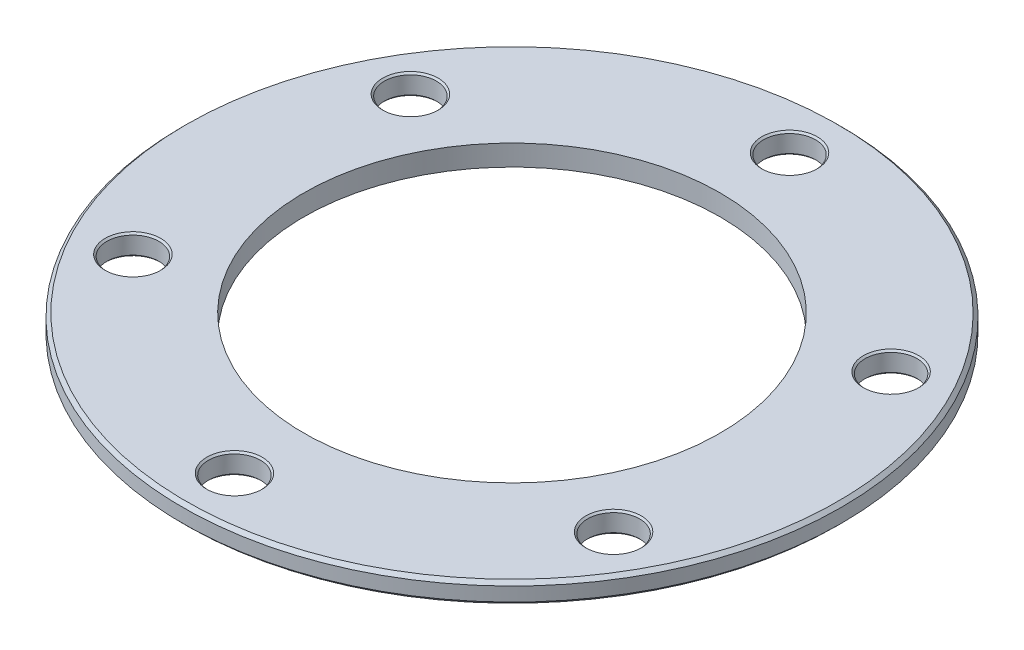
ISO-10303-21;
HEADER;
FILE_DESCRIPTION(('STEP AP214'),'2;1');
FILE_NAME('part.step','',(''),(''),'','','');
FILE_SCHEMA(('AUTOMOTIVE_DESIGN { 1 0 10303 214 1 1 1 1 }'));
ENDSEC;
DATA;
#1=APPLICATION_CONTEXT('core data for automotive mechanical design processes');
#2=APPLICATION_PROTOCOL_DEFINITION('international standard','automotive_design',2000,#1);
#3=PRODUCT_CONTEXT('',#1,'mechanical');
#4=PRODUCT('Part','Part','',(#3));
#5=PRODUCT_RELATED_PRODUCT_CATEGORY('part','',(#4));
#6=PRODUCT_DEFINITION_FORMATION('','',#4);
#7=PRODUCT_DEFINITION_CONTEXT('part definition',#1,'design');
#8=PRODUCT_DEFINITION('design','',#6,#7);
#9=PRODUCT_DEFINITION_SHAPE('','',#8);
#10=(LENGTH_UNIT() NAMED_UNIT(*) SI_UNIT(.MILLI.,.METRE.));
#11=(NAMED_UNIT(*) PLANE_ANGLE_UNIT() SI_UNIT($,.RADIAN.));
#12=(NAMED_UNIT(*) SI_UNIT($,.STERADIAN.) SOLID_ANGLE_UNIT());
#13=UNCERTAINTY_MEASURE_WITH_UNIT(LENGTH_MEASURE(1.E-05),#10,'distance_accuracy_value','');
#14=(GEOMETRIC_REPRESENTATION_CONTEXT(3) GLOBAL_UNCERTAINTY_ASSIGNED_CONTEXT((#13)) GLOBAL_UNIT_ASSIGNED_CONTEXT((#10,
#11,#12)) REPRESENTATION_CONTEXT('',''));
#15=CARTESIAN_POINT('',(0.,0.,0.));
#16=DIRECTION('',(0.,0.,1.));
#17=DIRECTION('',(1.,0.,0.));
#18=AXIS2_PLACEMENT_3D('',#15,#16,#17);
#19=CARTESIAN_POINT('',(0.,5.,0.));
#20=DIRECTION('',(0.,-1.,0.));
#21=DIRECTION('',(1.,0.,0.));
#22=AXIS2_PLACEMENT_3D('',#19,#20,#21);
#23=CYLINDRICAL_SURFACE('',#22,95.);
#24=CARTESIAN_POINT('',(0.,-1.14491749414469E-13,0.));
#25=DIRECTION('',(0.,-1.,0.));
#26=DIRECTION('',(1.,0.,0.));
#27=AXIS2_PLACEMENT_3D('',#24,#25,#26);
#28=CIRCLE('',#27,95.);
#29=CARTESIAN_POINT('',(95.,-1.02857604822569E-13,0.));
#30=VERTEX_POINT('',#29);
#31=EDGE_CURVE('E51',#30,#30,#28,.F.);
#32=ORIENTED_EDGE('',*,*,#31,.T.);
#33=EDGE_LOOP('',(#32));
#34=FACE_BOUND('',#33,.T.);
#35=CARTESIAN_POINT('',(0.,4.00000000000002,0.));
#36=DIRECTION('',(0.,1.,0.));
#37=DIRECTION('',(-1.,0.,0.));
#38=AXIS2_PLACEMENT_3D('',#35,#36,#37);
#39=CIRCLE('',#38,95.);
#40=CARTESIAN_POINT('',(-95.,4.00000000000001,0.));
#41=VERTEX_POINT('',#40);
#42=EDGE_CURVE('E55',#41,#41,#39,.F.);
#43=ORIENTED_EDGE('',*,*,#42,.T.);
#44=EDGE_LOOP('',(#43));
#45=FACE_BOUND('',#44,.T.);
#46=ADVANCED_FACE('F43',(#34,#45),#23,.T.);
#47=CARTESIAN_POINT('',(95.,5.00000000000001,0.));
#48=DIRECTION('',(0.,1.,0.));
#49=DIRECTION('',(-1.,0.,0.));
#50=AXIS2_PLACEMENT_3D('',#47,#48,#49);
#51=PLANE('',#50);
#52=CARTESIAN_POINT('',(0.,4.99999999999999,0.));
#53=DIRECTION('',(0.,1.,0.));
#54=DIRECTION('',(-1.,0.,0.));
#55=AXIS2_PLACEMENT_3D('',#52,#53,#54);
#56=CIRCLE('',#55,94.);
#57=CARTESIAN_POINT('',(-94.,4.99999999999998,0.));
#58=VERTEX_POINT('',#57);
#59=EDGE_CURVE('E10',#58,#58,#56,.T.);
#60=ORIENTED_EDGE('',*,*,#59,.T.);
#61=EDGE_LOOP('',(#60));
#62=FACE_BOUND('',#61,.T.);
#63=CARTESIAN_POINT('',(-69.2820323027551,4.99999999999999,-40.));
#64=DIRECTION('',(0.,1.,0.));
#65=DIRECTION('',(-1.,0.,0.));
#66=AXIS2_PLACEMENT_3D('',#63,#64,#65);
#67=CIRCLE('',#66,7.99999999999997);
#68=CARTESIAN_POINT('',(-77.2820323027551,4.99999999999999,-40.));
#69=VERTEX_POINT('',#68);
#70=EDGE_CURVE('E76',#69,#69,#67,.F.);
#71=ORIENTED_EDGE('',*,*,#70,.T.);
#72=EDGE_LOOP('',(#71));
#73=FACE_BOUND('',#72,.T.);
#74=CARTESIAN_POINT('',(69.2820323027551,5.,40.));
#75=DIRECTION('',(0.,1.,0.));
#76=DIRECTION('',(-1.,0.,0.));
#77=AXIS2_PLACEMENT_3D('',#74,#75,#76);
#78=CIRCLE('',#77,7.99999999999997);
#79=CARTESIAN_POINT('',(61.2820323027551,5.,40.));
#80=VERTEX_POINT('',#79);
#81=EDGE_CURVE('E79',#80,#80,#78,.F.);
#82=ORIENTED_EDGE('',*,*,#81,.T.);
#83=EDGE_LOOP('',(#82));
#84=FACE_BOUND('',#83,.T.);
#85=CARTESIAN_POINT('',(0.,4.99999999999999,80.));
#86=DIRECTION('',(0.,1.,0.));
#87=DIRECTION('',(-1.,0.,0.));
#88=AXIS2_PLACEMENT_3D('',#85,#86,#87);
#89=CIRCLE('',#88,7.99999999999995);
#90=CARTESIAN_POINT('',(-7.99999999999995,4.99999999999999,80.));
#91=VERTEX_POINT('',#90);
#92=EDGE_CURVE('E82',#91,#91,#89,.F.);
#93=ORIENTED_EDGE('',*,*,#92,.T.);
#94=EDGE_LOOP('',(#93));
#95=FACE_BOUND('',#94,.T.);
#96=CARTESIAN_POINT('',(0.,4.99999999999999,-80.));
#97=DIRECTION('',(0.,1.,0.));
#98=DIRECTION('',(-1.,0.,0.));
#99=AXIS2_PLACEMENT_3D('',#96,#97,#98);
#100=CIRCLE('',#99,7.99999999999995);
#101=CARTESIAN_POINT('',(-7.99999999999996,4.99999999999999,-80.));
#102=VERTEX_POINT('',#101);
#103=EDGE_CURVE('E85',#102,#102,#100,.F.);
#104=ORIENTED_EDGE('',*,*,#103,.T.);
#105=EDGE_LOOP('',(#104));
#106=FACE_BOUND('',#105,.T.);
#107=CARTESIAN_POINT('',(-69.2820323027551,4.99999999999999,40.));
#108=DIRECTION('',(0.,1.,0.));
#109=DIRECTION('',(-1.,0.,0.));
#110=AXIS2_PLACEMENT_3D('',#107,#108,#109);
#111=CIRCLE('',#110,7.99999999999989);
#112=CARTESIAN_POINT('',(-77.282032302755,4.99999999999999,40.));
#113=VERTEX_POINT('',#112);
#114=EDGE_CURVE('E88',#113,#113,#111,.F.);
#115=ORIENTED_EDGE('',*,*,#114,.T.);
#116=EDGE_LOOP('',(#115));
#117=FACE_BOUND('',#116,.T.);
#118=CARTESIAN_POINT('',(69.2820323027551,5.,-40.));
#119=DIRECTION('',(0.,1.,0.));
#120=DIRECTION('',(-1.,0.,0.));
#121=AXIS2_PLACEMENT_3D('',#118,#119,#120);
#122=CIRCLE('',#121,7.99999999999997);
#123=CARTESIAN_POINT('',(61.2820323027551,5.,-40.));
#124=VERTEX_POINT('',#123);
#125=EDGE_CURVE('E91',#124,#124,#122,.F.);
#126=ORIENTED_EDGE('',*,*,#125,.T.);
#127=EDGE_LOOP('',(#126));
#128=FACE_BOUND('',#127,.T.);
#129=CARTESIAN_POINT('',(0.,5.,0.));
#130=DIRECTION('',(0.,-1.,0.));
#131=DIRECTION('',(0.,0.,-1.));
#132=AXIS2_PLACEMENT_3D('',#129,#130,#131);
#133=CIRCLE('',#132,60.);
#134=CARTESIAN_POINT('',(0.,5.,-60.));
#135=VERTEX_POINT('',#134);
#136=EDGE_CURVE('E136',#135,#135,#133,.T.);
#137=ORIENTED_EDGE('',*,*,#136,.T.);
#138=EDGE_LOOP('',(#137));
#139=FACE_BOUND('',#138,.T.);
#140=ADVANCED_FACE('F147',(#62,#73,#84,#95,#106,#117,#128,#139),#51,.T.);
#141=CARTESIAN_POINT('',(0.,-1.00000000000001,0.));
#142=DIRECTION('',(0.,-1.,0.));
#143=DIRECTION('',(1.,0.,0.));
#144=AXIS2_PLACEMENT_3D('',#141,#142,#143);
#145=PLANE('',#144);
#146=CARTESIAN_POINT('',(0.,-1.00000000000001,0.));
#147=DIRECTION('',(0.,-1.,0.));
#148=DIRECTION('',(1.,0.,0.));
#149=AXIS2_PLACEMENT_3D('',#146,#147,#148);
#150=CIRCLE('',#149,94.0000000000001);
#151=CARTESIAN_POINT('',(94.0000000000001,-0.999999999999994,0.));
#152=VERTEX_POINT('',#151);
#153=EDGE_CURVE('E59',#152,#152,#150,.T.);
#154=ORIENTED_EDGE('',*,*,#153,.T.);
#155=EDGE_LOOP('',(#154));
#156=FACE_BOUND('',#155,.T.);
#157=CARTESIAN_POINT('',(69.2820323027551,-0.999999999999997,-40.));
#158=DIRECTION('',(0.,-1.,0.));
#159=DIRECTION('',(1.,0.,0.));
#160=AXIS2_PLACEMENT_3D('',#157,#158,#159);
#161=CIRCLE('',#160,7.99999999999997);
#162=CARTESIAN_POINT('',(77.2820323027551,-0.999999999999996,-40.));
#163=VERTEX_POINT('',#162);
#164=EDGE_CURVE('E118',#163,#163,#161,.F.);
#165=ORIENTED_EDGE('',*,*,#164,.T.);
#166=EDGE_LOOP('',(#165));
#167=FACE_BOUND('',#166,.T.);
#168=CARTESIAN_POINT('',(0.,-1.00000000000001,80.));
#169=DIRECTION('',(0.,-1.,0.));
#170=DIRECTION('',(1.,0.,0.));
#171=AXIS2_PLACEMENT_3D('',#168,#169,#170);
#172=CIRCLE('',#171,7.99999999999991);
#173=CARTESIAN_POINT('',(7.99999999999991,-1.,80.));
#174=VERTEX_POINT('',#173);
#175=EDGE_CURVE('E121',#174,#174,#172,.F.);
#176=ORIENTED_EDGE('',*,*,#175,.T.);
#177=EDGE_LOOP('',(#176));
#178=FACE_BOUND('',#177,.T.);
#179=CARTESIAN_POINT('',(69.2820323027551,-0.999999999999997,40.));
#180=DIRECTION('',(0.,-1.,0.));
#181=DIRECTION('',(1.,0.,0.));
#182=AXIS2_PLACEMENT_3D('',#179,#180,#181);
#183=CIRCLE('',#182,7.99999999999997);
#184=CARTESIAN_POINT('',(77.2820323027551,-0.999999999999996,40.));
#185=VERTEX_POINT('',#184);
#186=EDGE_CURVE('E124',#185,#185,#183,.F.);
#187=ORIENTED_EDGE('',*,*,#186,.T.);
#188=EDGE_LOOP('',(#187));
#189=FACE_BOUND('',#188,.T.);
#190=CARTESIAN_POINT('',(-69.2820323027551,-1.00000000000001,40.));
#191=DIRECTION('',(0.,-1.,0.));
#192=DIRECTION('',(1.,0.,0.));
#193=AXIS2_PLACEMENT_3D('',#190,#191,#192);
#194=CIRCLE('',#193,8.00000000000001);
#195=CARTESIAN_POINT('',(-61.2820323027551,-1.00000000000001,40.));
#196=VERTEX_POINT('',#195);
#197=EDGE_CURVE('E127',#196,#196,#194,.F.);
#198=ORIENTED_EDGE('',*,*,#197,.T.);
#199=EDGE_LOOP('',(#198));
#200=FACE_BOUND('',#199,.T.);
#201=CARTESIAN_POINT('',(-69.2820323027551,-1.00000000000001,-40.));
#202=DIRECTION('',(0.,-1.,0.));
#203=DIRECTION('',(1.,0.,0.));
#204=AXIS2_PLACEMENT_3D('',#201,#202,#203);
#205=CIRCLE('',#204,7.99999999999997);
#206=CARTESIAN_POINT('',(-61.2820323027551,-1.00000000000001,-40.));
#207=VERTEX_POINT('',#206);
#208=EDGE_CURVE('E130',#207,#207,#205,.F.);
#209=ORIENTED_EDGE('',*,*,#208,.T.);
#210=EDGE_LOOP('',(#209));
#211=FACE_BOUND('',#210,.T.);
#212=CARTESIAN_POINT('',(0.,-1.00000000000001,-80.));
#213=DIRECTION('',(0.,-1.,0.));
#214=DIRECTION('',(1.,0.,0.));
#215=AXIS2_PLACEMENT_3D('',#212,#213,#214);
#216=CIRCLE('',#215,7.99999999999999);
#217=CARTESIAN_POINT('',(7.99999999999998,-1.,-80.));
#218=VERTEX_POINT('',#217);
#219=EDGE_CURVE('E133',#218,#218,#216,.F.);
#220=ORIENTED_EDGE('',*,*,#219,.T.);
#221=EDGE_LOOP('',(#220));
#222=FACE_BOUND('',#221,.T.);
#223=CARTESIAN_POINT('',(0.,-1.,0.));
#224=DIRECTION('',(0.,-1.,0.));
#225=DIRECTION('',(0.,0.,-1.));
#226=AXIS2_PLACEMENT_3D('',#223,#224,#225);
#227=CIRCLE('',#226,60.);
#228=CARTESIAN_POINT('',(0.,-1.,-60.));
#229=VERTEX_POINT('',#228);
#230=EDGE_CURVE('E139',#229,#229,#227,.T.);
#231=ORIENTED_EDGE('',*,*,#230,.F.);
#232=EDGE_LOOP('',(#231));
#233=FACE_BOUND('',#232,.T.);
#234=ADVANCED_FACE('F145',(#156,#167,#178,#189,#200,#211,#222,#233),#145,.T.);
#235=CARTESIAN_POINT('',(0.,-1.00000000000001,0.));
#236=DIRECTION('',(0.,-1.,0.));
#237=DIRECTION('',(0.,0.,-1.));
#238=AXIS2_PLACEMENT_3D('',#235,#236,#237);
#239=CYLINDRICAL_SURFACE('',#238,60.);
#240=ORIENTED_EDGE('',*,*,#136,.F.);
#241=EDGE_LOOP('',(#240));
#242=FACE_BOUND('',#241,.T.);
#243=ORIENTED_EDGE('',*,*,#230,.T.);
#244=EDGE_LOOP('',(#243));
#245=FACE_BOUND('',#244,.T.);
#246=ADVANCED_FACE('F143',(#242,#245),#239,.F.);
#247=CARTESIAN_POINT('',(0.,-1.00000000000001,-80.));
#248=DIRECTION('',(0.,-1.,0.));
#249=DIRECTION('',(0.,0.,-1.));
#250=AXIS2_PLACEMENT_3D('',#247,#248,#249);
#251=CYLINDRICAL_SURFACE('',#250,7.49999999999999);
#252=CARTESIAN_POINT('',(0.,4.50000000000004,-80.));
#253=DIRECTION('',(0.,1.,0.));
#254=DIRECTION('',(0.,0.,1.));
#255=AXIS2_PLACEMENT_3D('',#252,#253,#254);
#256=CIRCLE('',#255,7.49999999999999);
#257=CARTESIAN_POINT('',(0.,4.50000000000004,-72.5));
#258=VERTEX_POINT('',#257);
#259=EDGE_CURVE('E64',#258,#258,#256,.T.);
#260=ORIENTED_EDGE('',*,*,#259,.T.);
#261=EDGE_LOOP('',(#260));
#262=FACE_BOUND('',#261,.T.);
#263=CARTESIAN_POINT('',(0.,-0.500000000000008,-80.));
#264=DIRECTION('',(0.,-1.,0.));
#265=DIRECTION('',(0.,0.,-1.));
#266=AXIS2_PLACEMENT_3D('',#263,#264,#265);
#267=CIRCLE('',#266,7.49999999999999);
#268=CARTESIAN_POINT('',(0.,-0.500000000000008,-87.5));
#269=VERTEX_POINT('',#268);
#270=EDGE_CURVE('E67',#269,#269,#267,.T.);
#271=ORIENTED_EDGE('',*,*,#270,.T.);
#272=EDGE_LOOP('',(#271));
#273=FACE_BOUND('',#272,.T.);
#274=ADVANCED_FACE('F155',(#262,#273),#251,.F.);
#275=CARTESIAN_POINT('',(-69.2820323027551,-1.00000000000001,-40.));
#276=DIRECTION('',(0.,-1.,0.));
#277=DIRECTION('',(0.,0.,-1.));
#278=AXIS2_PLACEMENT_3D('',#275,#276,#277);
#279=CYLINDRICAL_SURFACE('',#278,7.49999999999999);
#280=CARTESIAN_POINT('',(-69.2820323027551,4.49999999999999,-40.));
#281=DIRECTION('',(0.,1.,0.));
#282=DIRECTION('',(0.,0.,1.));
#283=AXIS2_PLACEMENT_3D('',#280,#281,#282);
#284=CIRCLE('',#283,7.49999999999999);
#285=CARTESIAN_POINT('',(-69.2820323027551,4.49999999999999,-32.5));
#286=VERTEX_POINT('',#285);
#287=EDGE_CURVE('E70',#286,#286,#284,.T.);
#288=ORIENTED_EDGE('',*,*,#287,.T.);
#289=EDGE_LOOP('',(#288));
#290=FACE_BOUND('',#289,.T.);
#291=CARTESIAN_POINT('',(-69.2820323027551,-0.500000000000019,-40.));
#292=DIRECTION('',(0.,-1.,0.));
#293=DIRECTION('',(0.,0.,-1.));
#294=AXIS2_PLACEMENT_3D('',#291,#292,#293);
#295=CIRCLE('',#294,7.49999999999999);
#296=CARTESIAN_POINT('',(-69.2820323027551,-0.500000000000019,-47.5));
#297=VERTEX_POINT('',#296);
#298=EDGE_CURVE('E73',#297,#297,#295,.T.);
#299=ORIENTED_EDGE('',*,*,#298,.T.);
#300=EDGE_LOOP('',(#299));
#301=FACE_BOUND('',#300,.T.);
#302=ADVANCED_FACE('F381',(#290,#301),#279,.F.);
#303=CARTESIAN_POINT('',(0.,4.99999999999999,80.));
#304=DIRECTION('',(0.,1.,0.));
#305=DIRECTION('',(0.,0.,1.));
#306=AXIS2_PLACEMENT_3D('',#303,#304,#305);
#307=CYLINDRICAL_SURFACE('',#306,7.49999999999999);
#308=CARTESIAN_POINT('',(0.,-0.500000000000079,80.));
#309=DIRECTION('',(0.,-1.,0.));
#310=DIRECTION('',(0.,0.,-1.));
#311=AXIS2_PLACEMENT_3D('',#308,#309,#310);
#312=CIRCLE('',#311,7.49999999999999);
#313=CARTESIAN_POINT('',(0.,-0.500000000000079,72.5));
#314=VERTEX_POINT('',#313);
#315=EDGE_CURVE('E106',#314,#314,#312,.T.);
#316=ORIENTED_EDGE('',*,*,#315,.T.);
#317=EDGE_LOOP('',(#316));
#318=FACE_BOUND('',#317,.T.);
#319=CARTESIAN_POINT('',(0.,4.50000000000003,80.));
#320=DIRECTION('',(0.,1.,0.));
#321=DIRECTION('',(0.,0.,1.));
#322=AXIS2_PLACEMENT_3D('',#319,#320,#321);
#323=CIRCLE('',#322,7.49999999999999);
#324=CARTESIAN_POINT('',(0.,4.50000000000003,87.5));
#325=VERTEX_POINT('',#324);
#326=EDGE_CURVE('E109',#325,#325,#323,.T.);
#327=ORIENTED_EDGE('',*,*,#326,.T.);
#328=EDGE_LOOP('',(#327));
#329=FACE_BOUND('',#328,.T.);
#330=ADVANCED_FACE('F371',(#318,#329),#307,.F.);
#331=CARTESIAN_POINT('',(69.2820323027551,4.99999999999999,40.));
#332=DIRECTION('',(0.,1.,0.));
#333=DIRECTION('',(0.,0.,1.));
#334=AXIS2_PLACEMENT_3D('',#331,#332,#333);
#335=CYLINDRICAL_SURFACE('',#334,7.49999999999999);
#336=CARTESIAN_POINT('',(69.2820323027551,-0.499999999999996,40.));
#337=DIRECTION('',(0.,-1.,0.));
#338=DIRECTION('',(0.,0.,-1.));
#339=AXIS2_PLACEMENT_3D('',#336,#337,#338);
#340=CIRCLE('',#339,7.49999999999999);
#341=CARTESIAN_POINT('',(69.2820323027551,-0.499999999999996,32.5));
#342=VERTEX_POINT('',#341);
#343=EDGE_CURVE('E100',#342,#342,#340,.T.);
#344=ORIENTED_EDGE('',*,*,#343,.T.);
#345=EDGE_LOOP('',(#344));
#346=FACE_BOUND('',#345,.T.);
#347=CARTESIAN_POINT('',(69.2820323027551,4.50000000000001,40.));
#348=DIRECTION('',(0.,1.,0.));
#349=DIRECTION('',(0.,0.,1.));
#350=AXIS2_PLACEMENT_3D('',#347,#348,#349);
#351=CIRCLE('',#350,7.49999999999999);
#352=CARTESIAN_POINT('',(69.2820323027551,4.50000000000001,47.5));
#353=VERTEX_POINT('',#352);
#354=EDGE_CURVE('E103',#353,#353,#351,.T.);
#355=ORIENTED_EDGE('',*,*,#354,.T.);
#356=EDGE_LOOP('',(#355));
#357=FACE_BOUND('',#356,.T.);
#358=ADVANCED_FACE('F361',(#346,#357),#335,.F.);
#359=CARTESIAN_POINT('',(69.2820323027551,4.99999999999999,-40.));
#360=DIRECTION('',(0.,1.,0.));
#361=DIRECTION('',(0.,0.,1.));
#362=AXIS2_PLACEMENT_3D('',#359,#360,#361);
#363=CYLINDRICAL_SURFACE('',#362,7.49999999999999);
#364=CARTESIAN_POINT('',(69.2820323027551,-0.499999999999996,-40.));
#365=DIRECTION('',(0.,-1.,0.));
#366=DIRECTION('',(0.,0.,-1.));
#367=AXIS2_PLACEMENT_3D('',#364,#365,#366);
#368=CIRCLE('',#367,7.49999999999999);
#369=CARTESIAN_POINT('',(69.2820323027551,-0.499999999999996,-47.5));
#370=VERTEX_POINT('',#369);
#371=EDGE_CURVE('E112',#370,#370,#368,.T.);
#372=ORIENTED_EDGE('',*,*,#371,.T.);
#373=EDGE_LOOP('',(#372));
#374=FACE_BOUND('',#373,.T.);
#375=CARTESIAN_POINT('',(69.2820323027551,4.50000000000001,-40.));
#376=DIRECTION('',(0.,1.,0.));
#377=DIRECTION('',(0.,0.,1.));
#378=AXIS2_PLACEMENT_3D('',#375,#376,#377);
#379=CIRCLE('',#378,7.49999999999999);
#380=CARTESIAN_POINT('',(69.2820323027551,4.50000000000001,-32.5));
#381=VERTEX_POINT('',#380);
#382=EDGE_CURVE('E115',#381,#381,#379,.T.);
#383=ORIENTED_EDGE('',*,*,#382,.T.);
#384=EDGE_LOOP('',(#383));
#385=FACE_BOUND('',#384,.T.);
#386=ADVANCED_FACE('F351',(#374,#385),#363,.F.);
#387=CARTESIAN_POINT('',(-69.2820323027551,4.99999999999999,40.));
#388=DIRECTION('',(0.,1.,0.));
#389=DIRECTION('',(0.,0.,1.));
#390=AXIS2_PLACEMENT_3D('',#387,#388,#389);
#391=CYLINDRICAL_SURFACE('',#390,7.49999999999999);
#392=CARTESIAN_POINT('',(-69.2820323027551,-0.499999999999987,40.));
#393=DIRECTION('',(0.,-1.,0.));
#394=DIRECTION('',(0.,0.,-1.));
#395=AXIS2_PLACEMENT_3D('',#392,#393,#394);
#396=CIRCLE('',#395,7.49999999999999);
#397=CARTESIAN_POINT('',(-69.2820323027551,-0.499999999999987,32.5));
#398=VERTEX_POINT('',#397);
#399=EDGE_CURVE('E94',#398,#398,#396,.T.);
#400=ORIENTED_EDGE('',*,*,#399,.T.);
#401=EDGE_LOOP('',(#400));
#402=FACE_BOUND('',#401,.T.);
#403=CARTESIAN_POINT('',(-69.2820323027551,4.50000000000007,40.));
#404=DIRECTION('',(0.,1.,0.));
#405=DIRECTION('',(0.,0.,1.));
#406=AXIS2_PLACEMENT_3D('',#403,#404,#405);
#407=CIRCLE('',#406,7.49999999999999);
#408=CARTESIAN_POINT('',(-69.2820323027551,4.50000000000007,47.5));
#409=VERTEX_POINT('',#408);
#410=EDGE_CURVE('E97',#409,#409,#407,.T.);
#411=ORIENTED_EDGE('',*,*,#410,.T.);
#412=EDGE_LOOP('',(#411));
#413=FACE_BOUND('',#412,.T.);
#414=ADVANCED_FACE('F175',(#402,#413),#391,.F.);
#415=CARTESIAN_POINT('',(69.2820323027551,-0.999999999999997,-40.));
#416=DIRECTION('',(0.,-1.,0.));
#417=DIRECTION('',(0.,0.,-1.));
#418=AXIS2_PLACEMENT_3D('',#415,#416,#417);
#419=CONICAL_SURFACE('',#418,7.99999999999997,0.785398163397427);
#420=ORIENTED_EDGE('',*,*,#371,.F.);
#421=EDGE_LOOP('',(#420));
#422=FACE_BOUND('',#421,.T.);
#423=ORIENTED_EDGE('',*,*,#164,.F.);
#424=EDGE_LOOP('',(#423));
#425=FACE_BOUND('',#424,.T.);
#426=ADVANCED_FACE('F168',(#422,#425),#419,.F.);
#427=CARTESIAN_POINT('',(0.,-1.00000000000001,80.));
#428=DIRECTION('',(0.,-1.,0.));
#429=DIRECTION('',(0.,0.,-1.));
#430=AXIS2_PLACEMENT_3D('',#427,#428,#429);
#431=CONICAL_SURFACE('',#430,7.99999999999991,0.785398163397439);
#432=ORIENTED_EDGE('',*,*,#315,.F.);
#433=EDGE_LOOP('',(#432));
#434=FACE_BOUND('',#433,.T.);
#435=ORIENTED_EDGE('',*,*,#175,.F.);
#436=EDGE_LOOP('',(#435));
#437=FACE_BOUND('',#436,.T.);
#438=ADVANCED_FACE('F174',(#434,#437),#431,.F.);
#439=CARTESIAN_POINT('',(69.2820323027551,-0.999999999999997,40.));
#440=DIRECTION('',(0.,-1.,0.));
#441=DIRECTION('',(0.,0.,-1.));
#442=AXIS2_PLACEMENT_3D('',#439,#440,#441);
#443=CONICAL_SURFACE('',#442,7.99999999999997,0.785398163397427);
#444=ORIENTED_EDGE('',*,*,#343,.F.);
#445=EDGE_LOOP('',(#444));
#446=FACE_BOUND('',#445,.T.);
#447=ORIENTED_EDGE('',*,*,#186,.F.);
#448=EDGE_LOOP('',(#447));
#449=FACE_BOUND('',#448,.T.);
#450=ADVANCED_FACE('F182',(#446,#449),#443,.F.);
#451=CARTESIAN_POINT('',(-69.2820323027551,-1.00000000000001,40.));
#452=DIRECTION('',(0.,-1.,0.));
#453=DIRECTION('',(0.,0.,-1.));
#454=AXIS2_PLACEMENT_3D('',#451,#452,#453);
#455=CONICAL_SURFACE('',#454,8.00000000000001,0.785398163397442);
#456=ORIENTED_EDGE('',*,*,#399,.F.);
#457=EDGE_LOOP('',(#456));
#458=FACE_BOUND('',#457,.T.);
#459=ORIENTED_EDGE('',*,*,#197,.F.);
#460=EDGE_LOOP('',(#459));
#461=FACE_BOUND('',#460,.T.);
#462=ADVANCED_FACE('F189',(#458,#461),#455,.F.);
#463=CARTESIAN_POINT('',(-69.2820323027551,4.99999999999999,-40.));
#464=DIRECTION('',(0.,1.,0.));
#465=DIRECTION('',(0.,0.,1.));
#466=AXIS2_PLACEMENT_3D('',#463,#464,#465);
#467=CONICAL_SURFACE('',#466,7.99999999999997,0.785398163397428);
#468=ORIENTED_EDGE('',*,*,#287,.F.);
#469=EDGE_LOOP('',(#468));
#470=FACE_BOUND('',#469,.T.);
#471=ORIENTED_EDGE('',*,*,#70,.F.);
#472=EDGE_LOOP('',(#471));
#473=FACE_BOUND('',#472,.T.);
#474=ADVANCED_FACE('F196',(#470,#473),#467,.F.);
#475=CARTESIAN_POINT('',(69.2820323027551,4.50000000000001,40.));
#476=DIRECTION('',(0.,1.,0.));
#477=DIRECTION('',(0.,0.,1.));
#478=AXIS2_PLACEMENT_3D('',#475,#476,#477);
#479=CONICAL_SURFACE('',#478,7.49999999999999,0.785398163397433);
#480=ORIENTED_EDGE('',*,*,#81,.F.);
#481=EDGE_LOOP('',(#480));
#482=FACE_BOUND('',#481,.T.);
#483=ORIENTED_EDGE('',*,*,#354,.F.);
#484=EDGE_LOOP('',(#483));
#485=FACE_BOUND('',#484,.T.);
#486=ADVANCED_FACE('F203',(#482,#485),#479,.F.);
#487=CARTESIAN_POINT('',(-69.2820323027551,-0.500000000000019,-40.));
#488=DIRECTION('',(0.,-1.,0.));
#489=DIRECTION('',(0.,0.,-1.));
#490=AXIS2_PLACEMENT_3D('',#487,#488,#489);
#491=CONICAL_SURFACE('',#490,7.49999999999999,0.785398163397433);
#492=ORIENTED_EDGE('',*,*,#208,.F.);
#493=EDGE_LOOP('',(#492));
#494=FACE_BOUND('',#493,.T.);
#495=ORIENTED_EDGE('',*,*,#298,.F.);
#496=EDGE_LOOP('',(#495));
#497=FACE_BOUND('',#496,.T.);
#498=ADVANCED_FACE('F210',(#494,#497),#491,.F.);
#499=CARTESIAN_POINT('',(0.,4.50000000000003,80.));
#500=DIRECTION('',(0.,1.,0.));
#501=DIRECTION('',(0.,0.,1.));
#502=AXIS2_PLACEMENT_3D('',#499,#500,#501);
#503=CONICAL_SURFACE('',#502,7.49999999999999,0.785398163397438);
#504=ORIENTED_EDGE('',*,*,#92,.F.);
#505=EDGE_LOOP('',(#504));
#506=FACE_BOUND('',#505,.T.);
#507=ORIENTED_EDGE('',*,*,#326,.F.);
#508=EDGE_LOOP('',(#507));
#509=FACE_BOUND('',#508,.T.);
#510=ADVANCED_FACE('F217',(#506,#509),#503,.F.);
#511=CARTESIAN_POINT('',(0.,4.99999999999999,-80.));
#512=DIRECTION('',(0.,1.,0.));
#513=DIRECTION('',(0.,0.,1.));
#514=AXIS2_PLACEMENT_3D('',#511,#512,#513);
#515=CONICAL_SURFACE('',#514,7.99999999999995,0.785398163397453);
#516=ORIENTED_EDGE('',*,*,#259,.F.);
#517=EDGE_LOOP('',(#516));
#518=FACE_BOUND('',#517,.T.);
#519=ORIENTED_EDGE('',*,*,#103,.F.);
#520=EDGE_LOOP('',(#519));
#521=FACE_BOUND('',#520,.T.);
#522=ADVANCED_FACE('F224',(#518,#521),#515,.F.);
#523=CARTESIAN_POINT('',(0.,-0.500000000000008,-80.));
#524=DIRECTION('',(0.,-1.,0.));
#525=DIRECTION('',(0.,0.,-1.));
#526=AXIS2_PLACEMENT_3D('',#523,#524,#525);
#527=CONICAL_SURFACE('',#526,7.49999999999999,0.785398163397451);
#528=ORIENTED_EDGE('',*,*,#219,.F.);
#529=EDGE_LOOP('',(#528));
#530=FACE_BOUND('',#529,.T.);
#531=ORIENTED_EDGE('',*,*,#270,.F.);
#532=EDGE_LOOP('',(#531));
#533=FACE_BOUND('',#532,.T.);
#534=ADVANCED_FACE('F231',(#530,#533),#527,.F.);
#535=CARTESIAN_POINT('',(-69.2820323027551,4.50000000000007,40.));
#536=DIRECTION('',(0.,1.,0.));
#537=DIRECTION('',(0.,0.,1.));
#538=AXIS2_PLACEMENT_3D('',#535,#536,#537);
#539=CONICAL_SURFACE('',#538,7.49999999999999,0.785398163397428);
#540=ORIENTED_EDGE('',*,*,#114,.F.);
#541=EDGE_LOOP('',(#540));
#542=FACE_BOUND('',#541,.T.);
#543=ORIENTED_EDGE('',*,*,#410,.F.);
#544=EDGE_LOOP('',(#543));
#545=FACE_BOUND('',#544,.T.);
#546=ADVANCED_FACE('F238',(#542,#545),#539,.F.);
#547=CARTESIAN_POINT('',(69.2820323027551,4.50000000000001,-40.));
#548=DIRECTION('',(0.,1.,0.));
#549=DIRECTION('',(0.,0.,1.));
#550=AXIS2_PLACEMENT_3D('',#547,#548,#549);
#551=CONICAL_SURFACE('',#550,7.49999999999999,0.785398163397433);
#552=ORIENTED_EDGE('',*,*,#125,.F.);
#553=EDGE_LOOP('',(#552));
#554=FACE_BOUND('',#553,.T.);
#555=ORIENTED_EDGE('',*,*,#382,.F.);
#556=EDGE_LOOP('',(#555));
#557=FACE_BOUND('',#556,.T.);
#558=ADVANCED_FACE('F245',(#554,#557),#551,.F.);
#559=CARTESIAN_POINT('',(0.,-1.00000000000001,0.));
#560=DIRECTION('',(0.,1.,0.));
#561=DIRECTION('',(-1.,0.,0.));
#562=AXIS2_PLACEMENT_3D('',#559,#560,#561);
#563=CONICAL_SURFACE('',#562,94.0000000000001,0.785398163397462);
#564=ORIENTED_EDGE('',*,*,#31,.F.);
#565=EDGE_LOOP('',(#564));
#566=FACE_BOUND('',#565,.T.);
#567=ORIENTED_EDGE('',*,*,#153,.F.);
#568=EDGE_LOOP('',(#567));
#569=FACE_BOUND('',#568,.T.);
#570=ADVANCED_FACE('F250',(#566,#569),#563,.T.);
#571=CARTESIAN_POINT('',(0.,4.00000000000002,0.));
#572=DIRECTION('',(0.,-1.,0.));
#573=DIRECTION('',(1.,0.,0.));
#574=AXIS2_PLACEMENT_3D('',#571,#572,#573);
#575=CONICAL_SURFACE('',#574,95.,0.785398163397455);
#576=ORIENTED_EDGE('',*,*,#59,.F.);
#577=EDGE_LOOP('',(#576));
#578=FACE_BOUND('',#577,.T.);
#579=ORIENTED_EDGE('',*,*,#42,.F.);
#580=EDGE_LOOP('',(#579));
#581=FACE_BOUND('',#580,.T.);
#582=ADVANCED_FACE('F46',(#578,#581),#575,.T.);
#583=CLOSED_SHELL('',(#46,#140,#234,#246,#274,#302,#330,#358,#386,#414,#426,#438,#450,#462,#474,
#486,#498,#510,#522,#534,#546,#558,#570,#582));
#584=MANIFOLD_SOLID_BREP('B2',#583);
#585=ADVANCED_BREP_SHAPE_REPRESENTATION('',(#18,#584),#14);
#586=SHAPE_DEFINITION_REPRESENTATION(#9,#585);
ENDSEC;
END-ISO-10303-21;
